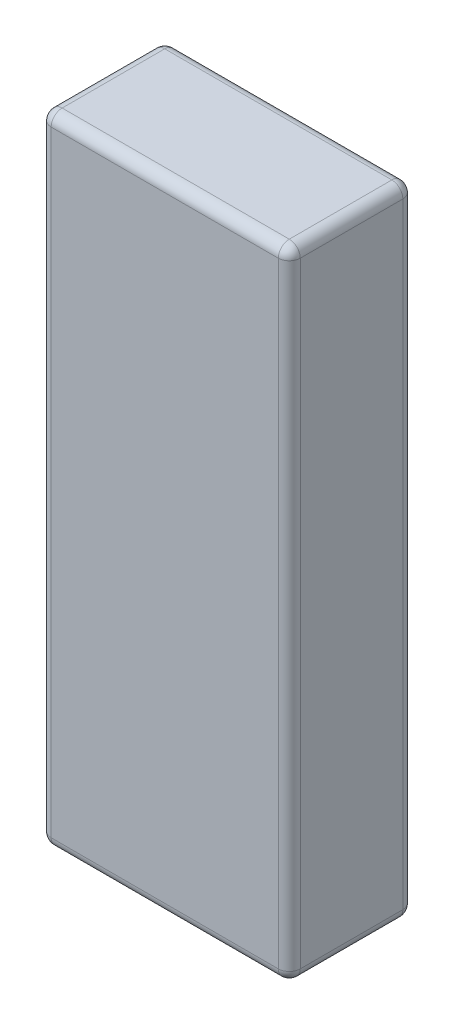
ISO-10303-21;
HEADER;
FILE_DESCRIPTION(('STEP AP214'),'2;1');
FILE_NAME('part.step','',(''),(''),'','','');
FILE_SCHEMA(('AUTOMOTIVE_DESIGN { 1 0 10303 214 1 1 1 1 }'));
ENDSEC;
DATA;
#1=APPLICATION_CONTEXT('core data for automotive mechanical design processes');
#2=APPLICATION_PROTOCOL_DEFINITION('international standard','automotive_design',2000,#1);
#3=PRODUCT_CONTEXT('',#1,'mechanical');
#4=PRODUCT('Part','Part','',(#3));
#5=PRODUCT_RELATED_PRODUCT_CATEGORY('part','',(#4));
#6=PRODUCT_DEFINITION_FORMATION('','',#4);
#7=PRODUCT_DEFINITION_CONTEXT('part definition',#1,'design');
#8=PRODUCT_DEFINITION('design','',#6,#7);
#9=PRODUCT_DEFINITION_SHAPE('','',#8);
#10=(LENGTH_UNIT() NAMED_UNIT(*) SI_UNIT(.MILLI.,.METRE.));
#11=(NAMED_UNIT(*) PLANE_ANGLE_UNIT() SI_UNIT($,.RADIAN.));
#12=(NAMED_UNIT(*) SI_UNIT($,.STERADIAN.) SOLID_ANGLE_UNIT());
#13=UNCERTAINTY_MEASURE_WITH_UNIT(LENGTH_MEASURE(1.E-05),#10,'distance_accuracy_value','');
#14=(GEOMETRIC_REPRESENTATION_CONTEXT(3) GLOBAL_UNCERTAINTY_ASSIGNED_CONTEXT((#13)) GLOBAL_UNIT_ASSIGNED_CONTEXT((#10,
#11,#12)) REPRESENTATION_CONTEXT('',''));
#15=CARTESIAN_POINT('',(0.,0.,0.));
#16=DIRECTION('',(0.,0.,1.));
#17=DIRECTION('',(1.,0.,0.));
#18=AXIS2_PLACEMENT_3D('',#15,#16,#17);
#19=CARTESIAN_POINT('',(0.,0.,17.));
#20=DIRECTION('',(1.,0.,0.));
#21=DIRECTION('',(0.,0.,-1.));
#22=AXIS2_PLACEMENT_3D('',#19,#20,#21);
#23=PLANE('',#22);
#24=DIRECTION('',(0.,0.,-1.));
#25=VECTOR('',#24,1.);
#26=CARTESIAN_POINT('',(0.,85.5,17.));
#27=LINE('',#26,#25);
#28=CARTESIAN_POINT('',(0.,85.5,15.5));
#29=VERTEX_POINT('',#28);
#30=CARTESIAN_POINT('',(0.,85.5,1.5));
#31=VERTEX_POINT('',#30);
#32=EDGE_CURVE('E132',#29,#31,#27,.T.);
#33=ORIENTED_EDGE('',*,*,#32,.T.);
#34=DIRECTION('',(0.,-1.,0.));
#35=VECTOR('',#34,1.);
#36=CARTESIAN_POINT('',(0.,0.,1.5));
#37=LINE('',#36,#35);
#38=CARTESIAN_POINT('',(0.,1.5,1.5));
#39=VERTEX_POINT('',#38);
#40=EDGE_CURVE('E128',#31,#39,#37,.T.);
#41=ORIENTED_EDGE('',*,*,#40,.T.);
#42=DIRECTION('',(0.,0.,-1.));
#43=VECTOR('',#42,1.);
#44=CARTESIAN_POINT('',(0.,1.5,17.));
#45=LINE('',#44,#43);
#46=CARTESIAN_POINT('',(0.,1.5,15.5));
#47=VERTEX_POINT('',#46);
#48=EDGE_CURVE('E121',#39,#47,#45,.F.);
#49=ORIENTED_EDGE('',*,*,#48,.T.);
#50=DIRECTION('',(0.,-1.,0.));
#51=VECTOR('',#50,1.);
#52=CARTESIAN_POINT('',(0.,0.,15.5));
#53=LINE('',#52,#51);
#54=EDGE_CURVE('E125',#47,#29,#53,.F.);
#55=ORIENTED_EDGE('',*,*,#54,.T.);
#56=EDGE_LOOP('',(#33,#41,#49,#55));
#57=FACE_BOUND('',#56,.T.);
#58=ADVANCED_FACE('F33',(#57),#23,.F.);
#59=CARTESIAN_POINT('',(0.,0.,17.));
#60=DIRECTION('',(0.,1.,0.));
#61=DIRECTION('',(0.,0.,1.));
#62=AXIS2_PLACEMENT_3D('',#59,#60,#61);
#63=PLANE('',#62);
#64=DIRECTION('',(0.,0.,-1.));
#65=VECTOR('',#64,1.);
#66=CARTESIAN_POINT('',(1.5,0.,17.));
#67=LINE('',#66,#65);
#68=CARTESIAN_POINT('',(1.5,0.,15.5));
#69=VERTEX_POINT('',#68);
#70=CARTESIAN_POINT('',(1.5,0.,1.5));
#71=VERTEX_POINT('',#70);
#72=EDGE_CURVE('E140',#69,#71,#67,.T.);
#73=ORIENTED_EDGE('',*,*,#72,.T.);
#74=DIRECTION('',(1.,0.,0.));
#75=VECTOR('',#74,1.);
#76=CARTESIAN_POINT('',(34.,0.,1.5));
#77=LINE('',#76,#75);
#78=CARTESIAN_POINT('',(32.5,0.,1.5));
#79=VERTEX_POINT('',#78);
#80=EDGE_CURVE('E178',#71,#79,#77,.T.);
#81=ORIENTED_EDGE('',*,*,#80,.T.);
#82=DIRECTION('',(0.,0.,-1.));
#83=VECTOR('',#82,1.);
#84=CARTESIAN_POINT('',(32.5,0.,17.));
#85=LINE('',#84,#83);
#86=CARTESIAN_POINT('',(32.5,0.,15.5));
#87=VERTEX_POINT('',#86);
#88=EDGE_CURVE('E175',#79,#87,#85,.F.);
#89=ORIENTED_EDGE('',*,*,#88,.T.);
#90=DIRECTION('',(1.,0.,0.));
#91=VECTOR('',#90,1.);
#92=CARTESIAN_POINT('',(0.,0.,15.5));
#93=LINE('',#92,#91);
#94=EDGE_CURVE('E173',#87,#69,#93,.F.);
#95=ORIENTED_EDGE('',*,*,#94,.T.);
#96=EDGE_LOOP('',(#73,#81,#89,#95));
#97=FACE_BOUND('',#96,.T.);
#98=ADVANCED_FACE('F295',(#97),#63,.F.);
#99=CARTESIAN_POINT('',(34.,0.,17.));
#100=DIRECTION('',(-1.,0.,0.));
#101=DIRECTION('',(0.,0.,1.));
#102=AXIS2_PLACEMENT_3D('',#99,#100,#101);
#103=PLANE('',#102);
#104=DIRECTION('',(0.,0.,-1.));
#105=VECTOR('',#104,1.);
#106=CARTESIAN_POINT('',(34.,1.5,17.));
#107=LINE('',#106,#105);
#108=CARTESIAN_POINT('',(34.,1.5,15.5));
#109=VERTEX_POINT('',#108);
#110=CARTESIAN_POINT('',(34.,1.5,1.5));
#111=VERTEX_POINT('',#110);
#112=EDGE_CURVE('E184',#109,#111,#107,.T.);
#113=ORIENTED_EDGE('',*,*,#112,.T.);
#114=DIRECTION('',(0.,1.,0.));
#115=VECTOR('',#114,1.);
#116=CARTESIAN_POINT('',(34.,87.,1.5));
#117=LINE('',#116,#115);
#118=CARTESIAN_POINT('',(34.,85.5,1.5));
#119=VERTEX_POINT('',#118);
#120=EDGE_CURVE('E187',#111,#119,#117,.T.);
#121=ORIENTED_EDGE('',*,*,#120,.T.);
#122=DIRECTION('',(0.,0.,-1.));
#123=VECTOR('',#122,1.);
#124=CARTESIAN_POINT('',(34.,85.5,17.));
#125=LINE('',#124,#123);
#126=CARTESIAN_POINT('',(34.,85.5,15.5));
#127=VERTEX_POINT('',#126);
#128=EDGE_CURVE('E182',#119,#127,#125,.F.);
#129=ORIENTED_EDGE('',*,*,#128,.T.);
#130=DIRECTION('',(0.,1.,0.));
#131=VECTOR('',#130,1.);
#132=CARTESIAN_POINT('',(34.,0.,15.5));
#133=LINE('',#132,#131);
#134=EDGE_CURVE('E180',#127,#109,#133,.F.);
#135=ORIENTED_EDGE('',*,*,#134,.T.);
#136=EDGE_LOOP('',(#113,#121,#129,#135));
#137=FACE_BOUND('',#136,.T.);
#138=ADVANCED_FACE('F272',(#137),#103,.F.);
#139=CARTESIAN_POINT('',(0.,87.,17.));
#140=DIRECTION('',(0.,-1.,0.));
#141=DIRECTION('',(0.,0.,-1.));
#142=AXIS2_PLACEMENT_3D('',#139,#140,#141);
#143=PLANE('',#142);
#144=DIRECTION('',(0.,0.,-1.));
#145=VECTOR('',#144,1.);
#146=CARTESIAN_POINT('',(32.5,87.,17.));
#147=LINE('',#146,#145);
#148=CARTESIAN_POINT('',(32.5,87.,15.5));
#149=VERTEX_POINT('',#148);
#150=CARTESIAN_POINT('',(32.5,87.,1.5));
#151=VERTEX_POINT('',#150);
#152=EDGE_CURVE('E166',#149,#151,#147,.T.);
#153=ORIENTED_EDGE('',*,*,#152,.T.);
#154=DIRECTION('',(-1.,0.,0.));
#155=VECTOR('',#154,1.);
#156=CARTESIAN_POINT('',(0.,87.,1.5));
#157=LINE('',#156,#155);
#158=CARTESIAN_POINT('',(1.5,87.,1.5));
#159=VERTEX_POINT('',#158);
#160=EDGE_CURVE('E171',#151,#159,#157,.T.);
#161=ORIENTED_EDGE('',*,*,#160,.T.);
#162=DIRECTION('',(0.,0.,-1.));
#163=VECTOR('',#162,1.);
#164=CARTESIAN_POINT('',(1.5,87.,17.));
#165=LINE('',#164,#163);
#166=CARTESIAN_POINT('',(1.5,87.,15.5));
#167=VERTEX_POINT('',#166);
#168=EDGE_CURVE('E168',#159,#167,#165,.F.);
#169=ORIENTED_EDGE('',*,*,#168,.T.);
#170=DIRECTION('',(-1.,0.,0.));
#171=VECTOR('',#170,1.);
#172=CARTESIAN_POINT('',(0.,87.,15.5));
#173=LINE('',#172,#171);
#174=EDGE_CURVE('E164',#167,#149,#173,.F.);
#175=ORIENTED_EDGE('',*,*,#174,.T.);
#176=EDGE_LOOP('',(#153,#161,#169,#175));
#177=FACE_BOUND('',#176,.T.);
#178=ADVANCED_FACE('F302',(#177),#143,.F.);
#179=CARTESIAN_POINT('',(0.,0.,17.));
#180=DIRECTION('',(0.,0.,-1.));
#181=DIRECTION('',(-1.,0.,0.));
#182=AXIS2_PLACEMENT_3D('',#179,#180,#181);
#183=PLANE('',#182);
#184=DIRECTION('',(0.,1.,0.));
#185=VECTOR('',#184,1.);
#186=CARTESIAN_POINT('',(32.5,0.,17.));
#187=LINE('',#186,#185);
#188=CARTESIAN_POINT('',(32.5,1.5,17.));
#189=VERTEX_POINT('',#188);
#190=CARTESIAN_POINT('',(32.5,85.5,17.));
#191=VERTEX_POINT('',#190);
#192=EDGE_CURVE('E42',#189,#191,#187,.T.);
#193=ORIENTED_EDGE('',*,*,#192,.T.);
#194=DIRECTION('',(-1.,0.,0.));
#195=VECTOR('',#194,1.);
#196=CARTESIAN_POINT('',(0.,85.5,17.));
#197=LINE('',#196,#195);
#198=CARTESIAN_POINT('',(1.5,85.5,17.));
#199=VERTEX_POINT('',#198);
#200=EDGE_CURVE('E11',#191,#199,#197,.T.);
#201=ORIENTED_EDGE('',*,*,#200,.T.);
#202=DIRECTION('',(0.,-1.,0.));
#203=VECTOR('',#202,1.);
#204=CARTESIAN_POINT('',(1.5,0.,17.));
#205=LINE('',#204,#203);
#206=CARTESIAN_POINT('',(1.5,1.5,17.));
#207=VERTEX_POINT('',#206);
#208=EDGE_CURVE('E198',#199,#207,#205,.T.);
#209=ORIENTED_EDGE('',*,*,#208,.T.);
#210=DIRECTION('',(1.,0.,0.));
#211=VECTOR('',#210,1.);
#212=CARTESIAN_POINT('',(0.,1.5,17.));
#213=LINE('',#212,#211);
#214=EDGE_CURVE('E53',#207,#189,#213,.T.);
#215=ORIENTED_EDGE('',*,*,#214,.T.);
#216=EDGE_LOOP('',(#193,#201,#209,#215));
#217=FACE_BOUND('',#216,.T.);
#218=ADVANCED_FACE('F365',(#217),#183,.F.);
#219=CARTESIAN_POINT('',(0.,0.,0.));
#220=DIRECTION('',(0.,0.,-1.));
#221=DIRECTION('',(-1.,0.,0.));
#222=AXIS2_PLACEMENT_3D('',#219,#220,#221);
#223=PLANE('',#222);
#224=DIRECTION('',(0.,1.,0.));
#225=VECTOR('',#224,1.);
#226=CARTESIAN_POINT('',(32.5,0.,0.));
#227=LINE('',#226,#225);
#228=CARTESIAN_POINT('',(32.5,85.5,0.));
#229=VERTEX_POINT('',#228);
#230=CARTESIAN_POINT('',(32.5,1.5,0.));
#231=VERTEX_POINT('',#230);
#232=EDGE_CURVE('E193',#229,#231,#227,.F.);
#233=ORIENTED_EDGE('',*,*,#232,.T.);
#234=DIRECTION('',(1.,0.,0.));
#235=VECTOR('',#234,1.);
#236=CARTESIAN_POINT('',(0.,1.5,0.));
#237=LINE('',#236,#235);
#238=CARTESIAN_POINT('',(1.5,1.5,0.));
#239=VERTEX_POINT('',#238);
#240=EDGE_CURVE('E195',#231,#239,#237,.F.);
#241=ORIENTED_EDGE('',*,*,#240,.T.);
#242=DIRECTION('',(0.,-1.,0.));
#243=VECTOR('',#242,1.);
#244=CARTESIAN_POINT('',(1.5,87.,0.));
#245=LINE('',#244,#243);
#246=CARTESIAN_POINT('',(1.5,85.5,0.));
#247=VERTEX_POINT('',#246);
#248=EDGE_CURVE('E189',#239,#247,#245,.F.);
#249=ORIENTED_EDGE('',*,*,#248,.T.);
#250=DIRECTION('',(-1.,0.,0.));
#251=VECTOR('',#250,1.);
#252=CARTESIAN_POINT('',(34.,85.5,0.));
#253=LINE('',#252,#251);
#254=EDGE_CURVE('E191',#247,#229,#253,.F.);
#255=ORIENTED_EDGE('',*,*,#254,.T.);
#256=EDGE_LOOP('',(#233,#241,#249,#255));
#257=FACE_BOUND('',#256,.T.);
#258=ADVANCED_FACE('F264',(#257),#223,.T.);
#259=CARTESIAN_POINT('',(32.5,1.5,17.));
#260=DIRECTION('',(0.,0.,-1.));
#261=DIRECTION('',(-1.,0.,0.));
#262=AXIS2_PLACEMENT_3D('',#259,#260,#261);
#263=CYLINDRICAL_SURFACE('',#262,1.5);
#264=CARTESIAN_POINT('',(32.5,1.5,15.5));
#265=DIRECTION('',(0.,0.,1.));
#266=DIRECTION('',(1.,0.,0.));
#267=AXIS2_PLACEMENT_3D('',#264,#265,#266);
#268=CIRCLE('',#267,1.5);
#269=EDGE_CURVE('E37',#87,#109,#268,.T.);
#270=ORIENTED_EDGE('',*,*,#269,.F.);
#271=ORIENTED_EDGE('',*,*,#88,.F.);
#272=CARTESIAN_POINT('',(32.5,1.5,1.5));
#273=DIRECTION('',(0.,0.,-1.));
#274=DIRECTION('',(-1.,0.,0.));
#275=AXIS2_PLACEMENT_3D('',#272,#273,#274);
#276=CIRCLE('',#275,1.5);
#277=EDGE_CURVE('E160',#111,#79,#276,.T.);
#278=ORIENTED_EDGE('',*,*,#277,.F.);
#279=ORIENTED_EDGE('',*,*,#112,.F.);
#280=EDGE_LOOP('',(#270,#271,#278,#279));
#281=FACE_BOUND('',#280,.T.);
#282=ADVANCED_FACE('F35',(#281),#263,.T.);
#283=CARTESIAN_POINT('',(32.5,1.5,15.5));
#284=DIRECTION('',(0.,0.,1.));
#285=DIRECTION('',(1.,0.,0.));
#286=AXIS2_PLACEMENT_3D('',#283,#284,#285);
#287=SPHERICAL_SURFACE('',#286,1.5);
#288=CARTESIAN_POINT('',(32.5,1.5,15.5));
#289=DIRECTION('',(1.,0.,0.));
#290=DIRECTION('',(0.,0.,-1.));
#291=AXIS2_PLACEMENT_3D('',#288,#289,#290);
#292=CIRCLE('',#291,1.5);
#293=EDGE_CURVE('E245',#87,#189,#292,.F.);
#294=ORIENTED_EDGE('',*,*,#293,.F.);
#295=ORIENTED_EDGE('',*,*,#269,.T.);
#296=CARTESIAN_POINT('',(32.5,1.5,15.5));
#297=DIRECTION('',(0.,-1.,0.));
#298=DIRECTION('',(0.,0.,-1.));
#299=AXIS2_PLACEMENT_3D('',#296,#297,#298);
#300=CIRCLE('',#299,1.5);
#301=EDGE_CURVE('E247',#189,#109,#300,.F.);
#302=ORIENTED_EDGE('',*,*,#301,.F.);
#303=EDGE_LOOP('',(#294,#295,#302));
#304=FACE_BOUND('',#303,.T.);
#305=ADVANCED_FACE('F290',(#304),#287,.T.);
#306=CARTESIAN_POINT('',(32.5,1.5,1.5));
#307=DIRECTION('',(0.,0.,1.));
#308=DIRECTION('',(1.,0.,0.));
#309=AXIS2_PLACEMENT_3D('',#306,#307,#308);
#310=SPHERICAL_SURFACE('',#309,1.5);
#311=CARTESIAN_POINT('',(32.5,1.5,1.5));
#312=DIRECTION('',(0.,-1.,0.));
#313=DIRECTION('',(0.,0.,-1.));
#314=AXIS2_PLACEMENT_3D('',#311,#312,#313);
#315=CIRCLE('',#314,1.5);
#316=EDGE_CURVE('E239',#111,#231,#315,.F.);
#317=ORIENTED_EDGE('',*,*,#316,.F.);
#318=ORIENTED_EDGE('',*,*,#277,.T.);
#319=CARTESIAN_POINT('',(32.5,1.5,1.5));
#320=DIRECTION('',(1.,0.,0.));
#321=DIRECTION('',(0.,0.,-1.));
#322=AXIS2_PLACEMENT_3D('',#319,#320,#321);
#323=CIRCLE('',#322,1.5);
#324=EDGE_CURVE('E242',#231,#79,#323,.F.);
#325=ORIENTED_EDGE('',*,*,#324,.F.);
#326=EDGE_LOOP('',(#317,#318,#325));
#327=FACE_BOUND('',#326,.T.);
#328=ADVANCED_FACE('F254',(#327),#310,.T.);
#329=CARTESIAN_POINT('',(32.5,0.,15.5));
#330=DIRECTION('',(0.,1.,0.));
#331=DIRECTION('',(0.,0.,1.));
#332=AXIS2_PLACEMENT_3D('',#329,#330,#331);
#333=CYLINDRICAL_SURFACE('',#332,1.5);
#334=ORIENTED_EDGE('',*,*,#301,.T.);
#335=ORIENTED_EDGE('',*,*,#134,.F.);
#336=CARTESIAN_POINT('',(32.5,85.5,15.5));
#337=DIRECTION('',(0.,1.,0.));
#338=DIRECTION('',(0.,0.,1.));
#339=AXIS2_PLACEMENT_3D('',#336,#337,#338);
#340=CIRCLE('',#339,1.5);
#341=EDGE_CURVE('E233',#191,#127,#340,.T.);
#342=ORIENTED_EDGE('',*,*,#341,.F.);
#343=ORIENTED_EDGE('',*,*,#192,.F.);
#344=EDGE_LOOP('',(#334,#335,#342,#343));
#345=FACE_BOUND('',#344,.T.);
#346=ADVANCED_FACE('F285',(#345),#333,.T.);
#347=CARTESIAN_POINT('',(0.,1.5,15.5));
#348=DIRECTION('',(1.,0.,0.));
#349=DIRECTION('',(0.,0.,-1.));
#350=AXIS2_PLACEMENT_3D('',#347,#348,#349);
#351=CYLINDRICAL_SURFACE('',#350,1.5);
#352=ORIENTED_EDGE('',*,*,#293,.T.);
#353=ORIENTED_EDGE('',*,*,#214,.F.);
#354=CARTESIAN_POINT('',(1.5,1.5,15.5));
#355=DIRECTION('',(-1.,0.,0.));
#356=DIRECTION('',(0.,0.,1.));
#357=AXIS2_PLACEMENT_3D('',#354,#355,#356);
#358=CIRCLE('',#357,1.5);
#359=EDGE_CURVE('E144',#69,#207,#358,.T.);
#360=ORIENTED_EDGE('',*,*,#359,.F.);
#361=ORIENTED_EDGE('',*,*,#94,.F.);
#362=EDGE_LOOP('',(#352,#353,#360,#361));
#363=FACE_BOUND('',#362,.T.);
#364=ADVANCED_FACE('F293',(#363),#351,.T.);
#365=CARTESIAN_POINT('',(1.5,1.5,17.));
#366=DIRECTION('',(0.,0.,-1.));
#367=DIRECTION('',(-1.,0.,0.));
#368=AXIS2_PLACEMENT_3D('',#365,#366,#367);
#369=CYLINDRICAL_SURFACE('',#368,1.5);
#370=CARTESIAN_POINT('',(1.5,1.5,1.5));
#371=DIRECTION('',(0.,0.,-1.));
#372=DIRECTION('',(-1.,0.,0.));
#373=AXIS2_PLACEMENT_3D('',#370,#371,#372);
#374=CIRCLE('',#373,1.5);
#375=EDGE_CURVE('E145',#71,#39,#374,.T.);
#376=ORIENTED_EDGE('',*,*,#375,.F.);
#377=ORIENTED_EDGE('',*,*,#72,.F.);
#378=CARTESIAN_POINT('',(1.5,1.5,15.5));
#379=DIRECTION('',(0.,0.,1.));
#380=DIRECTION('',(1.,0.,0.));
#381=AXIS2_PLACEMENT_3D('',#378,#379,#380);
#382=CIRCLE('',#381,1.5);
#383=EDGE_CURVE('E136',#47,#69,#382,.T.);
#384=ORIENTED_EDGE('',*,*,#383,.F.);
#385=ORIENTED_EDGE('',*,*,#48,.F.);
#386=EDGE_LOOP('',(#376,#377,#384,#385));
#387=FACE_BOUND('',#386,.T.);
#388=ADVANCED_FACE('F138',(#387),#369,.T.);
#389=CARTESIAN_POINT('',(0.,1.5,1.5));
#390=DIRECTION('',(-1.,0.,0.));
#391=DIRECTION('',(0.,0.,1.));
#392=AXIS2_PLACEMENT_3D('',#389,#390,#391);
#393=CYLINDRICAL_SURFACE('',#392,1.5);
#394=ORIENTED_EDGE('',*,*,#324,.T.);
#395=ORIENTED_EDGE('',*,*,#80,.F.);
#396=CARTESIAN_POINT('',(1.5,1.5,1.5));
#397=DIRECTION('',(-1.,0.,0.));
#398=DIRECTION('',(0.,0.,1.));
#399=AXIS2_PLACEMENT_3D('',#396,#397,#398);
#400=CIRCLE('',#399,1.5);
#401=EDGE_CURVE('E229',#239,#71,#400,.T.);
#402=ORIENTED_EDGE('',*,*,#401,.F.);
#403=ORIENTED_EDGE('',*,*,#240,.F.);
#404=EDGE_LOOP('',(#394,#395,#402,#403));
#405=FACE_BOUND('',#404,.T.);
#406=ADVANCED_FACE('F261',(#405),#393,.T.);
#407=CARTESIAN_POINT('',(32.5,0.,1.5));
#408=DIRECTION('',(0.,-1.,0.));
#409=DIRECTION('',(0.,0.,-1.));
#410=AXIS2_PLACEMENT_3D('',#407,#408,#409);
#411=CYLINDRICAL_SURFACE('',#410,1.5);
#412=ORIENTED_EDGE('',*,*,#316,.T.);
#413=ORIENTED_EDGE('',*,*,#232,.F.);
#414=CARTESIAN_POINT('',(32.5,85.5,1.5));
#415=DIRECTION('',(0.,1.,0.));
#416=DIRECTION('',(0.,0.,1.));
#417=AXIS2_PLACEMENT_3D('',#414,#415,#416);
#418=CIRCLE('',#417,1.5);
#419=EDGE_CURVE('E226',#119,#229,#418,.T.);
#420=ORIENTED_EDGE('',*,*,#419,.F.);
#421=ORIENTED_EDGE('',*,*,#120,.F.);
#422=EDGE_LOOP('',(#412,#413,#420,#421));
#423=FACE_BOUND('',#422,.T.);
#424=ADVANCED_FACE('F269',(#423),#411,.T.);
#425=CARTESIAN_POINT('',(32.5,85.5,17.));
#426=DIRECTION('',(0.,0.,-1.));
#427=DIRECTION('',(-1.,0.,0.));
#428=AXIS2_PLACEMENT_3D('',#425,#426,#427);
#429=CYLINDRICAL_SURFACE('',#428,1.5);
#430=CARTESIAN_POINT('',(32.5,85.5,15.5));
#431=DIRECTION('',(0.,0.,1.));
#432=DIRECTION('',(1.,0.,0.));
#433=AXIS2_PLACEMENT_3D('',#430,#431,#432);
#434=CIRCLE('',#433,1.5);
#435=EDGE_CURVE('E236',#127,#149,#434,.T.);
#436=ORIENTED_EDGE('',*,*,#435,.F.);
#437=ORIENTED_EDGE('',*,*,#128,.F.);
#438=CARTESIAN_POINT('',(32.5,85.5,1.5));
#439=DIRECTION('',(0.,0.,-1.));
#440=DIRECTION('',(-1.,0.,0.));
#441=AXIS2_PLACEMENT_3D('',#438,#439,#440);
#442=CIRCLE('',#441,1.5);
#443=EDGE_CURVE('E223',#151,#119,#442,.T.);
#444=ORIENTED_EDGE('',*,*,#443,.F.);
#445=ORIENTED_EDGE('',*,*,#152,.F.);
#446=EDGE_LOOP('',(#436,#437,#444,#445));
#447=FACE_BOUND('',#446,.T.);
#448=ADVANCED_FACE('F277',(#447),#429,.T.);
#449=CARTESIAN_POINT('',(32.5,85.5,15.5));
#450=DIRECTION('',(0.,0.,1.));
#451=DIRECTION('',(1.,0.,0.));
#452=AXIS2_PLACEMENT_3D('',#449,#450,#451);
#453=SPHERICAL_SURFACE('',#452,1.5);
#454=ORIENTED_EDGE('',*,*,#341,.T.);
#455=ORIENTED_EDGE('',*,*,#435,.T.);
#456=CARTESIAN_POINT('',(32.5,85.5,15.5));
#457=DIRECTION('',(1.,0.,0.));
#458=DIRECTION('',(0.,0.,-1.));
#459=AXIS2_PLACEMENT_3D('',#456,#457,#458);
#460=CIRCLE('',#459,1.5);
#461=EDGE_CURVE('E152',#191,#149,#460,.F.);
#462=ORIENTED_EDGE('',*,*,#461,.F.);
#463=EDGE_LOOP('',(#454,#455,#462));
#464=FACE_BOUND('',#463,.T.);
#465=ADVANCED_FACE('F282',(#464),#453,.T.);
#466=CARTESIAN_POINT('',(1.5,1.5,15.5));
#467=DIRECTION('',(0.,0.,1.));
#468=DIRECTION('',(1.,0.,0.));
#469=AXIS2_PLACEMENT_3D('',#466,#467,#468);
#470=SPHERICAL_SURFACE('',#469,1.5);
#471=ORIENTED_EDGE('',*,*,#383,.T.);
#472=ORIENTED_EDGE('',*,*,#359,.T.);
#473=CARTESIAN_POINT('',(1.5,1.5,15.5));
#474=DIRECTION('',(0.,-1.,0.));
#475=DIRECTION('',(0.,0.,-1.));
#476=AXIS2_PLACEMENT_3D('',#473,#474,#475);
#477=CIRCLE('',#476,1.5);
#478=EDGE_CURVE('E148',#47,#207,#477,.F.);
#479=ORIENTED_EDGE('',*,*,#478,.F.);
#480=EDGE_LOOP('',(#471,#472,#479));
#481=FACE_BOUND('',#480,.T.);
#482=ADVANCED_FACE('F149',(#481),#470,.T.);
#483=CARTESIAN_POINT('',(1.5,1.5,1.5));
#484=DIRECTION('',(0.,0.,1.));
#485=DIRECTION('',(1.,0.,0.));
#486=AXIS2_PLACEMENT_3D('',#483,#484,#485);
#487=SPHERICAL_SURFACE('',#486,1.5);
#488=ORIENTED_EDGE('',*,*,#401,.T.);
#489=ORIENTED_EDGE('',*,*,#375,.T.);
#490=CARTESIAN_POINT('',(1.5,1.5,1.5));
#491=DIRECTION('',(0.,-1.,0.));
#492=DIRECTION('',(0.,0.,-1.));
#493=AXIS2_PLACEMENT_3D('',#490,#491,#492);
#494=CIRCLE('',#493,1.5);
#495=EDGE_CURVE('E153',#239,#39,#494,.F.);
#496=ORIENTED_EDGE('',*,*,#495,.F.);
#497=EDGE_LOOP('',(#488,#489,#496));
#498=FACE_BOUND('',#497,.T.);
#499=ADVANCED_FACE('F336',(#498),#487,.T.);
#500=CARTESIAN_POINT('',(32.5,85.5,1.5));
#501=DIRECTION('',(0.,0.,1.));
#502=DIRECTION('',(1.,0.,0.));
#503=AXIS2_PLACEMENT_3D('',#500,#501,#502);
#504=SPHERICAL_SURFACE('',#503,1.5);
#505=ORIENTED_EDGE('',*,*,#443,.T.);
#506=ORIENTED_EDGE('',*,*,#419,.T.);
#507=CARTESIAN_POINT('',(32.5,85.5,1.5));
#508=DIRECTION('',(1.,0.,0.));
#509=DIRECTION('',(0.,0.,-1.));
#510=AXIS2_PLACEMENT_3D('',#507,#508,#509);
#511=CIRCLE('',#510,1.5);
#512=EDGE_CURVE('E216',#151,#229,#511,.F.);
#513=ORIENTED_EDGE('',*,*,#512,.F.);
#514=EDGE_LOOP('',(#505,#506,#513));
#515=FACE_BOUND('',#514,.T.);
#516=ADVANCED_FACE('F332',(#515),#504,.T.);
#517=CARTESIAN_POINT('',(0.,85.5,15.5));
#518=DIRECTION('',(-1.,0.,0.));
#519=DIRECTION('',(0.,0.,1.));
#520=AXIS2_PLACEMENT_3D('',#517,#518,#519);
#521=CYLINDRICAL_SURFACE('',#520,1.5);
#522=ORIENTED_EDGE('',*,*,#461,.T.);
#523=ORIENTED_EDGE('',*,*,#174,.F.);
#524=CARTESIAN_POINT('',(1.5,85.5,15.5));
#525=DIRECTION('',(-1.,0.,0.));
#526=DIRECTION('',(0.,0.,1.));
#527=AXIS2_PLACEMENT_3D('',#524,#525,#526);
#528=CIRCLE('',#527,1.5);
#529=EDGE_CURVE('E213',#199,#167,#528,.T.);
#530=ORIENTED_EDGE('',*,*,#529,.F.);
#531=ORIENTED_EDGE('',*,*,#200,.F.);
#532=EDGE_LOOP('',(#522,#523,#530,#531));
#533=FACE_BOUND('',#532,.T.);
#534=ADVANCED_FACE('F329',(#533),#521,.T.);
#535=CARTESIAN_POINT('',(1.5,0.,15.5));
#536=DIRECTION('',(0.,-1.,0.));
#537=DIRECTION('',(0.,0.,-1.));
#538=AXIS2_PLACEMENT_3D('',#535,#536,#537);
#539=CYLINDRICAL_SURFACE('',#538,1.5);
#540=ORIENTED_EDGE('',*,*,#478,.T.);
#541=ORIENTED_EDGE('',*,*,#208,.F.);
#542=CARTESIAN_POINT('',(1.5,85.5,15.5));
#543=DIRECTION('',(0.,1.,0.));
#544=DIRECTION('',(0.,0.,1.));
#545=AXIS2_PLACEMENT_3D('',#542,#543,#544);
#546=CIRCLE('',#545,1.5);
#547=EDGE_CURVE('E156',#29,#199,#546,.T.);
#548=ORIENTED_EDGE('',*,*,#547,.F.);
#549=ORIENTED_EDGE('',*,*,#54,.F.);
#550=EDGE_LOOP('',(#540,#541,#548,#549));
#551=FACE_BOUND('',#550,.T.);
#552=ADVANCED_FACE('F155',(#551),#539,.T.);
#553=CARTESIAN_POINT('',(1.5,0.,1.5));
#554=DIRECTION('',(0.,1.,0.));
#555=DIRECTION('',(0.,0.,1.));
#556=AXIS2_PLACEMENT_3D('',#553,#554,#555);
#557=CYLINDRICAL_SURFACE('',#556,1.5);
#558=ORIENTED_EDGE('',*,*,#495,.T.);
#559=ORIENTED_EDGE('',*,*,#40,.F.);
#560=CARTESIAN_POINT('',(1.5,85.5,1.5));
#561=DIRECTION('',(0.,1.,0.));
#562=DIRECTION('',(0.,0.,1.));
#563=AXIS2_PLACEMENT_3D('',#560,#561,#562);
#564=CIRCLE('',#563,1.5);
#565=EDGE_CURVE('E209',#247,#31,#564,.T.);
#566=ORIENTED_EDGE('',*,*,#565,.F.);
#567=ORIENTED_EDGE('',*,*,#248,.F.);
#568=EDGE_LOOP('',(#558,#559,#566,#567));
#569=FACE_BOUND('',#568,.T.);
#570=ADVANCED_FACE('F322',(#569),#557,.T.);
#571=CARTESIAN_POINT('',(0.,85.5,1.5));
#572=DIRECTION('',(1.,0.,0.));
#573=DIRECTION('',(0.,0.,-1.));
#574=AXIS2_PLACEMENT_3D('',#571,#572,#573);
#575=CYLINDRICAL_SURFACE('',#574,1.5);
#576=ORIENTED_EDGE('',*,*,#512,.T.);
#577=ORIENTED_EDGE('',*,*,#254,.F.);
#578=CARTESIAN_POINT('',(1.5,85.5,1.5));
#579=DIRECTION('',(-1.,0.,0.));
#580=DIRECTION('',(0.,0.,1.));
#581=AXIS2_PLACEMENT_3D('',#578,#579,#580);
#582=CIRCLE('',#581,1.5);
#583=EDGE_CURVE('E206',#159,#247,#582,.T.);
#584=ORIENTED_EDGE('',*,*,#583,.F.);
#585=ORIENTED_EDGE('',*,*,#160,.F.);
#586=EDGE_LOOP('',(#576,#577,#584,#585));
#587=FACE_BOUND('',#586,.T.);
#588=ADVANCED_FACE('F318',(#587),#575,.T.);
#589=CARTESIAN_POINT('',(1.5,85.5,15.5));
#590=DIRECTION('',(0.,0.,1.));
#591=DIRECTION('',(1.,0.,0.));
#592=AXIS2_PLACEMENT_3D('',#589,#590,#591);
#593=SPHERICAL_SURFACE('',#592,1.5);
#594=ORIENTED_EDGE('',*,*,#547,.T.);
#595=ORIENTED_EDGE('',*,*,#529,.T.);
#596=CARTESIAN_POINT('',(1.5,85.5,15.5));
#597=DIRECTION('',(0.,0.,1.));
#598=DIRECTION('',(1.,0.,0.));
#599=AXIS2_PLACEMENT_3D('',#596,#597,#598);
#600=CIRCLE('',#599,1.5);
#601=EDGE_CURVE('E204',#29,#167,#600,.F.);
#602=ORIENTED_EDGE('',*,*,#601,.F.);
#603=EDGE_LOOP('',(#594,#595,#602));
#604=FACE_BOUND('',#603,.T.);
#605=ADVANCED_FACE('F314',(#604),#593,.T.);
#606=CARTESIAN_POINT('',(1.5,85.5,1.5));
#607=DIRECTION('',(0.,0.,1.));
#608=DIRECTION('',(1.,0.,0.));
#609=AXIS2_PLACEMENT_3D('',#606,#607,#608);
#610=SPHERICAL_SURFACE('',#609,1.5);
#611=ORIENTED_EDGE('',*,*,#583,.T.);
#612=ORIENTED_EDGE('',*,*,#565,.T.);
#613=CARTESIAN_POINT('',(1.5,85.5,1.5));
#614=DIRECTION('',(0.,0.,-1.));
#615=DIRECTION('',(-1.,0.,0.));
#616=AXIS2_PLACEMENT_3D('',#613,#614,#615);
#617=CIRCLE('',#616,1.5);
#618=EDGE_CURVE('E202',#159,#31,#617,.F.);
#619=ORIENTED_EDGE('',*,*,#618,.F.);
#620=EDGE_LOOP('',(#611,#612,#619));
#621=FACE_BOUND('',#620,.T.);
#622=ADVANCED_FACE('F310',(#621),#610,.T.);
#623=CARTESIAN_POINT('',(1.5,85.5,17.));
#624=DIRECTION('',(0.,0.,-1.));
#625=DIRECTION('',(-1.,0.,0.));
#626=AXIS2_PLACEMENT_3D('',#623,#624,#625);
#627=CYLINDRICAL_SURFACE('',#626,1.5);
#628=ORIENTED_EDGE('',*,*,#601,.T.);
#629=ORIENTED_EDGE('',*,*,#168,.F.);
#630=ORIENTED_EDGE('',*,*,#618,.T.);
#631=ORIENTED_EDGE('',*,*,#32,.F.);
#632=EDGE_LOOP('',(#628,#629,#630,#631));
#633=FACE_BOUND('',#632,.T.);
#634=ADVANCED_FACE('F307',(#633),#627,.T.);
#635=CLOSED_SHELL('',(#58,#98,#138,#178,#218,#258,#282,#305,#328,#346,#364,#388,#406,#424,#448,
#465,#482,#499,#516,#534,#552,#570,#588,#605,#622,#634));
#636=MANIFOLD_SOLID_BREP('B2',#635);
#637=ADVANCED_BREP_SHAPE_REPRESENTATION('',(#18,#636),#14);
#638=SHAPE_DEFINITION_REPRESENTATION(#9,#637);
ENDSEC;
END-ISO-10303-21;
